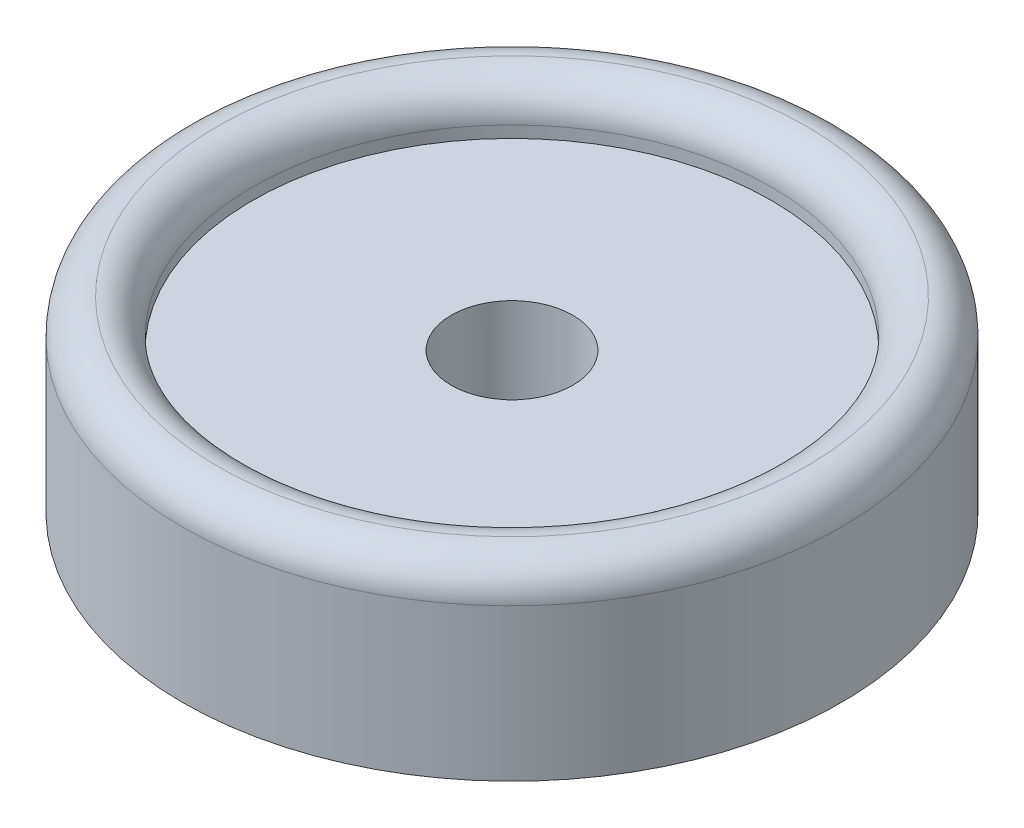
ISO-10303-21;
HEADER;
FILE_DESCRIPTION(('STEP AP214'),'2;1');
FILE_NAME('part.step','',(''),(''),'','','');
FILE_SCHEMA(('AUTOMOTIVE_DESIGN { 1 0 10303 214 1 1 1 1 }'));
ENDSEC;
DATA;
#1=APPLICATION_CONTEXT('core data for automotive mechanical design processes');
#2=APPLICATION_PROTOCOL_DEFINITION('international standard','automotive_design',2000,#1);
#3=PRODUCT_CONTEXT('',#1,'mechanical');
#4=PRODUCT('Part','Part','',(#3));
#5=PRODUCT_RELATED_PRODUCT_CATEGORY('part','',(#4));
#6=PRODUCT_DEFINITION_FORMATION('','',#4);
#7=PRODUCT_DEFINITION_CONTEXT('part definition',#1,'design');
#8=PRODUCT_DEFINITION('design','',#6,#7);
#9=PRODUCT_DEFINITION_SHAPE('','',#8);
#10=(LENGTH_UNIT() NAMED_UNIT(*) SI_UNIT(.MILLI.,.METRE.));
#11=(NAMED_UNIT(*) PLANE_ANGLE_UNIT() SI_UNIT($,.RADIAN.));
#12=(NAMED_UNIT(*) SI_UNIT($,.STERADIAN.) SOLID_ANGLE_UNIT());
#13=UNCERTAINTY_MEASURE_WITH_UNIT(LENGTH_MEASURE(1.E-05),#10,'distance_accuracy_value','');
#14=(GEOMETRIC_REPRESENTATION_CONTEXT(3) GLOBAL_UNCERTAINTY_ASSIGNED_CONTEXT((#13)) GLOBAL_UNIT_ASSIGNED_CONTEXT((#10,
#11,#12)) REPRESENTATION_CONTEXT('',''));
#15=CARTESIAN_POINT('',(0.,0.,0.));
#16=DIRECTION('',(0.,0.,1.));
#17=DIRECTION('',(1.,0.,0.));
#18=AXIS2_PLACEMENT_3D('',#15,#16,#17);
#19=CARTESIAN_POINT('',(0.,-47.,0.));
#20=DIRECTION('',(0.,-1.,0.));
#21=DIRECTION('',(0.,0.,-1.));
#22=AXIS2_PLACEMENT_3D('',#19,#20,#21);
#23=PLANE('',#22);
#24=CARTESIAN_POINT('',(0.,-47.,0.));
#25=DIRECTION('',(0.,-1.,0.));
#26=DIRECTION('',(0.,0.,-1.));
#27=AXIS2_PLACEMENT_3D('',#24,#25,#26);
#28=CIRCLE('',#27,11.1);
#29=CARTESIAN_POINT('',(0.,-47.,-11.1));
#30=VERTEX_POINT('',#29);
#31=EDGE_CURVE('E59',#30,#30,#28,.T.);
#32=ORIENTED_EDGE('',*,*,#31,.F.);
#33=EDGE_LOOP('',(#32));
#34=FACE_BOUND('',#33,.T.);
#35=CARTESIAN_POINT('',(0.,-47.,0.));
#36=DIRECTION('',(0.,-1.,0.));
#37=DIRECTION('',(0.,0.,-1.));
#38=AXIS2_PLACEMENT_3D('',#35,#36,#37);
#39=CIRCLE('',#38,2.6);
#40=CARTESIAN_POINT('',(0.,-47.,-2.6));
#41=VERTEX_POINT('',#40);
#42=EDGE_CURVE('E65',#41,#41,#39,.T.);
#43=ORIENTED_EDGE('',*,*,#42,.T.);
#44=EDGE_LOOP('',(#43));
#45=FACE_BOUND('',#44,.T.);
#46=ADVANCED_FACE('F45',(#34,#45),#23,.F.);
#47=CARTESIAN_POINT('',(0.,-53.,0.));
#48=DIRECTION('',(0.,-1.,0.));
#49=DIRECTION('',(0.,0.,-1.));
#50=AXIS2_PLACEMENT_3D('',#47,#48,#49);
#51=PLANE('',#50);
#52=CARTESIAN_POINT('',(0.,-53.,0.));
#53=DIRECTION('',(0.,1.,0.));
#54=DIRECTION('',(0.,0.,1.));
#55=AXIS2_PLACEMENT_3D('',#52,#53,#54);
#56=CIRCLE('',#55,2.6);
#57=CARTESIAN_POINT('',(0.,-53.,2.6));
#58=VERTEX_POINT('',#57);
#59=EDGE_CURVE('E69',#58,#58,#56,.T.);
#60=ORIENTED_EDGE('',*,*,#59,.T.);
#61=EDGE_LOOP('',(#60));
#62=FACE_BOUND('',#61,.T.);
#63=CARTESIAN_POINT('',(0.,-53.,0.));
#64=DIRECTION('',(0.,-1.,0.));
#65=DIRECTION('',(0.,0.,-1.));
#66=AXIS2_PLACEMENT_3D('',#63,#64,#65);
#67=CIRCLE('',#66,14.1);
#68=CARTESIAN_POINT('',(0.,-53.,-14.1));
#69=VERTEX_POINT('',#68);
#70=EDGE_CURVE('E73',#69,#69,#67,.T.);
#71=ORIENTED_EDGE('',*,*,#70,.T.);
#72=EDGE_LOOP('',(#71));
#73=FACE_BOUND('',#72,.T.);
#74=ADVANCED_FACE('F96',(#62,#73),#51,.T.);
#75=CARTESIAN_POINT('',(0.,-53.,0.));
#76=DIRECTION('',(0.,1.,0.));
#77=DIRECTION('',(0.,0.,1.));
#78=AXIS2_PLACEMENT_3D('',#75,#76,#77);
#79=CYLINDRICAL_SURFACE('',#78,2.6);
#80=ORIENTED_EDGE('',*,*,#59,.F.);
#81=EDGE_LOOP('',(#80));
#82=FACE_BOUND('',#81,.T.);
#83=ORIENTED_EDGE('',*,*,#42,.F.);
#84=EDGE_LOOP('',(#83));
#85=FACE_BOUND('',#84,.T.);
#86=ADVANCED_FACE('F103',(#82,#85),#79,.F.);
#87=CARTESIAN_POINT('',(0.,-45.,0.));
#88=DIRECTION('',(0.,-1.,0.));
#89=DIRECTION('',(0.,0.,-1.));
#90=AXIS2_PLACEMENT_3D('',#87,#88,#89);
#91=CYLINDRICAL_SURFACE('',#90,11.1);
#92=CARTESIAN_POINT('',(0.,-46.5,0.));
#93=DIRECTION('',(0.,-1.,0.));
#94=DIRECTION('',(0.,0.,-1.));
#95=AXIS2_PLACEMENT_3D('',#92,#93,#94);
#96=CIRCLE('',#95,11.1);
#97=CARTESIAN_POINT('',(0.,-46.5,-11.1));
#98=VERTEX_POINT('',#97);
#99=EDGE_CURVE('E10',#98,#98,#96,.F.);
#100=ORIENTED_EDGE('',*,*,#99,.T.);
#101=EDGE_LOOP('',(#100));
#102=FACE_BOUND('',#101,.T.);
#103=ORIENTED_EDGE('',*,*,#31,.T.);
#104=EDGE_LOOP('',(#103));
#105=FACE_BOUND('',#104,.T.);
#106=ADVANCED_FACE('F92',(#102,#105),#91,.F.);
#107=CARTESIAN_POINT('',(0.,-45.,0.));
#108=DIRECTION('',(0.,-1.,0.));
#109=DIRECTION('',(0.,0.,-1.));
#110=AXIS2_PLACEMENT_3D('',#107,#108,#109);
#111=CYLINDRICAL_SURFACE('',#110,14.1);
#112=CARTESIAN_POINT('',(0.,-46.5,0.));
#113=DIRECTION('',(0.,-1.,0.));
#114=DIRECTION('',(0.,0.,-1.));
#115=AXIS2_PLACEMENT_3D('',#112,#113,#114);
#116=CIRCLE('',#115,14.1);
#117=CARTESIAN_POINT('',(0.,-46.5,-14.1));
#118=VERTEX_POINT('',#117);
#119=EDGE_CURVE('E54',#118,#118,#116,.T.);
#120=ORIENTED_EDGE('',*,*,#119,.T.);
#121=EDGE_LOOP('',(#120));
#122=FACE_BOUND('',#121,.T.);
#123=ORIENTED_EDGE('',*,*,#70,.F.);
#124=EDGE_LOOP('',(#123));
#125=FACE_BOUND('',#124,.T.);
#126=ADVANCED_FACE('F86',(#122,#125),#111,.T.);
#127=CARTESIAN_POINT('',(0.,-46.5,0.));
#128=DIRECTION('',(0.,-1.,0.));
#129=DIRECTION('',(0.,0.,-1.));
#130=AXIS2_PLACEMENT_3D('',#127,#128,#129);
#131=TOROIDAL_SURFACE('',#130,12.6,1.5);
#132=ORIENTED_EDGE('',*,*,#99,.F.);
#133=EDGE_LOOP('',(#132));
#134=FACE_BOUND('',#133,.T.);
#135=CARTESIAN_POINT('',(0.,-45.,0.));
#136=DIRECTION('',(0.,-1.,0.));
#137=DIRECTION('',(0.,0.,-1.));
#138=AXIS2_PLACEMENT_3D('',#135,#136,#137);
#139=CIRCLE('',#138,12.6);
#140=CARTESIAN_POINT('',(0.,-45.,-12.6));
#141=VERTEX_POINT('',#140);
#142=EDGE_CURVE('E49',#141,#141,#139,.T.);
#143=ORIENTED_EDGE('',*,*,#142,.F.);
#144=EDGE_LOOP('',(#143));
#145=FACE_BOUND('',#144,.T.);
#146=ADVANCED_FACE('F47',(#134,#145),#131,.T.);
#147=CARTESIAN_POINT('',(0.,-46.5,0.));
#148=DIRECTION('',(0.,-1.,0.));
#149=DIRECTION('',(0.,0.,-1.));
#150=AXIS2_PLACEMENT_3D('',#147,#148,#149);
#151=TOROIDAL_SURFACE('',#150,12.6,1.5);
#152=ORIENTED_EDGE('',*,*,#142,.T.);
#153=EDGE_LOOP('',(#152));
#154=FACE_BOUND('',#153,.T.);
#155=ORIENTED_EDGE('',*,*,#119,.F.);
#156=EDGE_LOOP('',(#155));
#157=FACE_BOUND('',#156,.T.);
#158=ADVANCED_FACE('F82',(#154,#157),#151,.T.);
#159=CLOSED_SHELL('',(#46,#74,#86,#106,#126,#146,#158));
#160=MANIFOLD_SOLID_BREP('B2',#159);
#161=ADVANCED_BREP_SHAPE_REPRESENTATION('',(#18,#160),#14);
#162=SHAPE_DEFINITION_REPRESENTATION(#9,#161);
ENDSEC;
END-ISO-10303-21;
